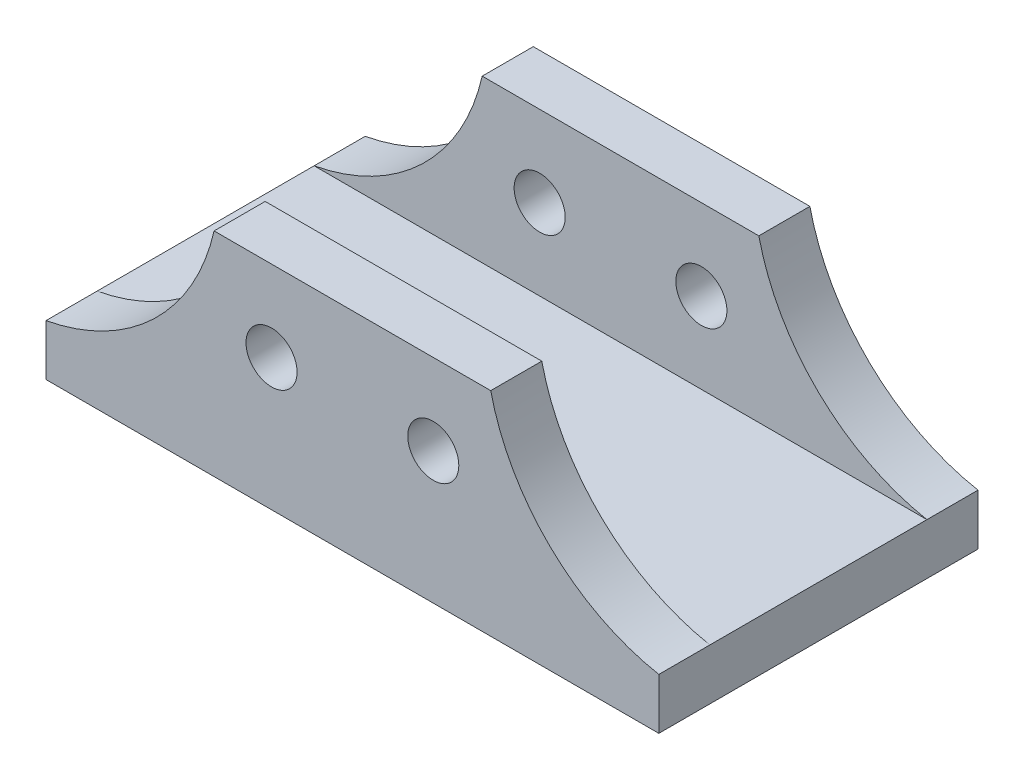
ISO-10303-21;
HEADER;
FILE_DESCRIPTION(('STEP AP214'),'2;1');
FILE_NAME('part.step','',(''),(''),'','','');
FILE_SCHEMA(('AUTOMOTIVE_DESIGN { 1 0 10303 214 1 1 1 1 }'));
ENDSEC;
DATA;
#1=APPLICATION_CONTEXT('core data for automotive mechanical design processes');
#2=APPLICATION_PROTOCOL_DEFINITION('international standard','automotive_design',2000,#1);
#3=PRODUCT_CONTEXT('',#1,'mechanical');
#4=PRODUCT('Part','Part','',(#3));
#5=PRODUCT_RELATED_PRODUCT_CATEGORY('part','',(#4));
#6=PRODUCT_DEFINITION_FORMATION('','',#4);
#7=PRODUCT_DEFINITION_CONTEXT('part definition',#1,'design');
#8=PRODUCT_DEFINITION('design','',#6,#7);
#9=PRODUCT_DEFINITION_SHAPE('','',#8);
#10=(LENGTH_UNIT() NAMED_UNIT(*) SI_UNIT(.MILLI.,.METRE.));
#11=(NAMED_UNIT(*) PLANE_ANGLE_UNIT() SI_UNIT($,.RADIAN.));
#12=(NAMED_UNIT(*) SI_UNIT($,.STERADIAN.) SOLID_ANGLE_UNIT());
#13=UNCERTAINTY_MEASURE_WITH_UNIT(LENGTH_MEASURE(1.E-05),#10,'distance_accuracy_value','');
#14=(GEOMETRIC_REPRESENTATION_CONTEXT(3) GLOBAL_UNCERTAINTY_ASSIGNED_CONTEXT((#13)) GLOBAL_UNIT_ASSIGNED_CONTEXT((#10,
#11,#12)) REPRESENTATION_CONTEXT('',''));
#15=CARTESIAN_POINT('',(0.,0.,0.));
#16=DIRECTION('',(0.,0.,1.));
#17=DIRECTION('',(1.,0.,0.));
#18=AXIS2_PLACEMENT_3D('',#15,#16,#17);
#19=CARTESIAN_POINT('',(81.2436376247931,61.1381233205086,12.));
#20=DIRECTION('',(0.,0.,-1.));
#21=DIRECTION('',(-1.,0.,0.));
#22=AXIS2_PLACEMENT_3D('',#19,#20,#21);
#23=PLANE('',#22);
#24=CARTESIAN_POINT('',(-19.,31.,12.));
#25=DIRECTION('',(0.,0.,1.));
#26=DIRECTION('',(-1.,0.,0.));
#27=AXIS2_PLACEMENT_3D('',#24,#25,#26);
#28=CIRCLE('',#27,6.);
#29=CARTESIAN_POINT('',(-25.,31.,12.));
#30=VERTEX_POINT('',#29);
#31=EDGE_CURVE('E177',#30,#30,#28,.T.);
#32=ORIENTED_EDGE('',*,*,#31,.F.);
#33=EDGE_LOOP('',(#32));
#34=FACE_BOUND('',#33,.T.);
#35=CARTESIAN_POINT('',(19.,31.,12.));
#36=DIRECTION('',(0.,0.,1.));
#37=DIRECTION('',(1.,0.,0.));
#38=AXIS2_PLACEMENT_3D('',#35,#36,#37);
#39=CIRCLE('',#38,6.);
#40=CARTESIAN_POINT('',(25.,31.,12.));
#41=VERTEX_POINT('',#40);
#42=EDGE_CURVE('E183',#41,#41,#39,.T.);
#43=ORIENTED_EDGE('',*,*,#42,.F.);
#44=EDGE_LOOP('',(#43));
#45=FACE_BOUND('',#44,.T.);
#46=DIRECTION('',(-1.,0.,0.));
#47=VECTOR('',#46,1.);
#48=CARTESIAN_POINT('',(-72.,12.,12.));
#49=LINE('',#48,#47);
#50=CARTESIAN_POINT('',(72.,12.,12.));
#51=VERTEX_POINT('',#50);
#52=CARTESIAN_POINT('',(-72.,12.,12.));
#53=VERTEX_POINT('',#52);
#54=EDGE_CURVE('E84',#51,#53,#49,.T.);
#55=ORIENTED_EDGE('',*,*,#54,.F.);
#56=CARTESIAN_POINT('',(81.2436376247931,61.1381233205086,12.));
#57=DIRECTION('',(0.,0.,-1.));
#58=DIRECTION('',(-1.,0.,0.));
#59=AXIS2_PLACEMENT_3D('',#56,#57,#58);
#60=CIRCLE('',#59,50.);
#61=CARTESIAN_POINT('',(32.5,50.,12.));
#62=VERTEX_POINT('',#61);
#63=EDGE_CURVE('E189',#51,#62,#60,.T.);
#64=ORIENTED_EDGE('',*,*,#63,.T.);
#65=DIRECTION('',(-1.,0.,0.));
#66=VECTOR('',#65,1.);
#67=CARTESIAN_POINT('',(-32.5,50.,12.));
#68=LINE('',#67,#66);
#69=CARTESIAN_POINT('',(-32.5,50.,12.));
#70=VERTEX_POINT('',#69);
#71=EDGE_CURVE('E50',#62,#70,#68,.T.);
#72=ORIENTED_EDGE('',*,*,#71,.T.);
#73=CARTESIAN_POINT('',(-81.2436376247931,61.1381233205086,12.));
#74=DIRECTION('',(0.,0.,-1.));
#75=DIRECTION('',(1.,0.,0.));
#76=AXIS2_PLACEMENT_3D('',#73,#74,#75);
#77=CIRCLE('',#76,50.);
#78=EDGE_CURVE('E192',#70,#53,#77,.T.);
#79=ORIENTED_EDGE('',*,*,#78,.T.);
#80=EDGE_LOOP('',(#55,#64,#72,#79));
#81=FACE_BOUND('',#80,.T.);
#82=ADVANCED_FACE('F33',(#34,#45,#81),#23,.F.);
#83=CARTESIAN_POINT('',(81.2436376247931,61.1381233205086,0.));
#84=DIRECTION('',(0.,0.,-1.));
#85=DIRECTION('',(-1.,0.,0.));
#86=AXIS2_PLACEMENT_3D('',#83,#84,#85);
#87=PLANE('',#86);
#88=CARTESIAN_POINT('',(19.,31.,0.));
#89=DIRECTION('',(0.,0.,1.));
#90=DIRECTION('',(1.,0.,0.));
#91=AXIS2_PLACEMENT_3D('',#88,#89,#90);
#92=CIRCLE('',#91,6.);
#93=CARTESIAN_POINT('',(25.,31.,0.));
#94=VERTEX_POINT('',#93);
#95=EDGE_CURVE('E180',#94,#94,#92,.T.);
#96=ORIENTED_EDGE('',*,*,#95,.T.);
#97=EDGE_LOOP('',(#96));
#98=FACE_BOUND('',#97,.T.);
#99=DIRECTION('',(0.,1.,0.));
#100=VECTOR('',#99,1.);
#101=CARTESIAN_POINT('',(72.,0.,0.));
#102=LINE('',#101,#100);
#103=CARTESIAN_POINT('',(72.,0.,0.));
#104=VERTEX_POINT('',#103);
#105=CARTESIAN_POINT('',(72.,12.,0.));
#106=VERTEX_POINT('',#105);
#107=EDGE_CURVE('E186',#104,#106,#102,.T.);
#108=ORIENTED_EDGE('',*,*,#107,.F.);
#109=DIRECTION('',(1.,0.,0.));
#110=VECTOR('',#109,1.);
#111=CARTESIAN_POINT('',(-72.,0.,0.));
#112=LINE('',#111,#110);
#113=CARTESIAN_POINT('',(-72.,0.,0.));
#114=VERTEX_POINT('',#113);
#115=EDGE_CURVE('E80',#114,#104,#112,.T.);
#116=ORIENTED_EDGE('',*,*,#115,.F.);
#117=DIRECTION('',(0.,-1.,0.));
#118=VECTOR('',#117,1.);
#119=CARTESIAN_POINT('',(-72.,0.,0.));
#120=LINE('',#119,#118);
#121=CARTESIAN_POINT('',(-72.,12.,0.));
#122=VERTEX_POINT('',#121);
#123=EDGE_CURVE('E74',#122,#114,#120,.T.);
#124=ORIENTED_EDGE('',*,*,#123,.F.);
#125=CARTESIAN_POINT('',(-81.2436376247931,61.1381233205086,0.));
#126=DIRECTION('',(0.,0.,-1.));
#127=DIRECTION('',(1.,0.,0.));
#128=AXIS2_PLACEMENT_3D('',#125,#126,#127);
#129=CIRCLE('',#128,50.);
#130=CARTESIAN_POINT('',(-32.5,50.,0.));
#131=VERTEX_POINT('',#130);
#132=EDGE_CURVE('E201',#131,#122,#129,.T.);
#133=ORIENTED_EDGE('',*,*,#132,.F.);
#134=DIRECTION('',(-1.,0.,0.));
#135=VECTOR('',#134,1.);
#136=CARTESIAN_POINT('',(-32.5,50.,0.));
#137=LINE('',#136,#135);
#138=CARTESIAN_POINT('',(32.5,50.,0.));
#139=VERTEX_POINT('',#138);
#140=EDGE_CURVE('E199',#139,#131,#137,.T.);
#141=ORIENTED_EDGE('',*,*,#140,.F.);
#142=CARTESIAN_POINT('',(81.2436376247931,61.1381233205086,0.));
#143=DIRECTION('',(0.,0.,-1.));
#144=DIRECTION('',(-1.,0.,0.));
#145=AXIS2_PLACEMENT_3D('',#142,#143,#144);
#146=CIRCLE('',#145,50.);
#147=EDGE_CURVE('E197',#106,#139,#146,.T.);
#148=ORIENTED_EDGE('',*,*,#147,.F.);
#149=EDGE_LOOP('',(#108,#116,#124,#133,#141,#148));
#150=FACE_BOUND('',#149,.T.);
#151=CARTESIAN_POINT('',(-19.,31.,0.));
#152=DIRECTION('',(0.,0.,1.));
#153=DIRECTION('',(-1.,0.,0.));
#154=AXIS2_PLACEMENT_3D('',#151,#152,#153);
#155=CIRCLE('',#154,6.);
#156=CARTESIAN_POINT('',(-25.,31.,0.));
#157=VERTEX_POINT('',#156);
#158=EDGE_CURVE('E171',#157,#157,#155,.T.);
#159=ORIENTED_EDGE('',*,*,#158,.T.);
#160=EDGE_LOOP('',(#159));
#161=FACE_BOUND('',#160,.T.);
#162=ADVANCED_FACE('F221',(#98,#150,#161),#87,.T.);
#163=CARTESIAN_POINT('',(72.,0.,12.));
#164=DIRECTION('',(-1.,0.,0.));
#165=DIRECTION('',(0.,0.,1.));
#166=AXIS2_PLACEMENT_3D('',#163,#164,#165);
#167=PLANE('',#166);
#168=ORIENTED_EDGE('',*,*,#107,.T.);
#169=DIRECTION('',(0.,0.,-1.));
#170=VECTOR('',#169,1.);
#171=CARTESIAN_POINT('',(72.,12.,12.));
#172=LINE('',#171,#170);
#173=EDGE_CURVE('E11',#51,#106,#172,.T.);
#174=ORIENTED_EDGE('',*,*,#173,.F.);
#175=DIRECTION('',(0.,0.,-1.));
#176=VECTOR('',#175,1.);
#177=CARTESIAN_POINT('',(72.,12.,207.499134945508));
#178=LINE('',#177,#176);
#179=CARTESIAN_POINT('',(72.,12.,63.));
#180=VERTEX_POINT('',#179);
#181=EDGE_CURVE('E172',#180,#51,#178,.T.);
#182=ORIENTED_EDGE('',*,*,#181,.F.);
#183=DIRECTION('',(0.,0.,1.));
#184=VECTOR('',#183,1.);
#185=CARTESIAN_POINT('',(72.,12.,63.));
#186=LINE('',#185,#184);
#187=CARTESIAN_POINT('',(72.,12.,75.));
#188=VERTEX_POINT('',#187);
#189=EDGE_CURVE('E130',#180,#188,#186,.T.);
#190=ORIENTED_EDGE('',*,*,#189,.T.);
#191=DIRECTION('',(0.,1.,0.));
#192=VECTOR('',#191,1.);
#193=CARTESIAN_POINT('',(72.,0.,75.));
#194=LINE('',#193,#192);
#195=CARTESIAN_POINT('',(72.,0.,75.));
#196=VERTEX_POINT('',#195);
#197=EDGE_CURVE('E149',#196,#188,#194,.T.);
#198=ORIENTED_EDGE('',*,*,#197,.F.);
#199=DIRECTION('',(0.,0.,-1.));
#200=VECTOR('',#199,1.);
#201=CARTESIAN_POINT('',(72.,0.,12.));
#202=LINE('',#201,#200);
#203=EDGE_CURVE('E194',#196,#104,#202,.T.);
#204=ORIENTED_EDGE('',*,*,#203,.T.);
#205=EDGE_LOOP('',(#168,#174,#182,#190,#198,#204));
#206=FACE_BOUND('',#205,.T.);
#207=ADVANCED_FACE('F35',(#206),#167,.F.);
#208=CARTESIAN_POINT('',(81.2436376247931,61.1381233205086,12.));
#209=DIRECTION('',(0.,0.,-1.));
#210=DIRECTION('',(-1.,0.,0.));
#211=AXIS2_PLACEMENT_3D('',#208,#209,#210);
#212=CYLINDRICAL_SURFACE('',#211,50.);
#213=ORIENTED_EDGE('',*,*,#147,.T.);
#214=DIRECTION('',(0.,0.,-1.));
#215=VECTOR('',#214,1.);
#216=CARTESIAN_POINT('',(32.5,50.,12.));
#217=LINE('',#216,#215);
#218=EDGE_CURVE('E42',#62,#139,#217,.T.);
#219=ORIENTED_EDGE('',*,*,#218,.F.);
#220=ORIENTED_EDGE('',*,*,#63,.F.);
#221=ORIENTED_EDGE('',*,*,#173,.T.);
#222=EDGE_LOOP('',(#213,#219,#220,#221));
#223=FACE_BOUND('',#222,.T.);
#224=ADVANCED_FACE('F235',(#223),#212,.F.);
#225=CARTESIAN_POINT('',(-32.5,50.,12.));
#226=DIRECTION('',(0.,-1.,0.));
#227=DIRECTION('',(0.,0.,-1.));
#228=AXIS2_PLACEMENT_3D('',#225,#226,#227);
#229=PLANE('',#228);
#230=ORIENTED_EDGE('',*,*,#140,.T.);
#231=DIRECTION('',(0.,0.,-1.));
#232=VECTOR('',#231,1.);
#233=CARTESIAN_POINT('',(-32.5,50.,12.));
#234=LINE('',#233,#232);
#235=EDGE_CURVE('E210',#70,#131,#234,.T.);
#236=ORIENTED_EDGE('',*,*,#235,.F.);
#237=ORIENTED_EDGE('',*,*,#71,.F.);
#238=ORIENTED_EDGE('',*,*,#218,.T.);
#239=EDGE_LOOP('',(#230,#236,#237,#238));
#240=FACE_BOUND('',#239,.T.);
#241=ADVANCED_FACE('F216',(#240),#229,.F.);
#242=CARTESIAN_POINT('',(-81.2436376247931,61.1381233205086,12.));
#243=DIRECTION('',(0.,0.,-1.));
#244=DIRECTION('',(-1.,0.,0.));
#245=AXIS2_PLACEMENT_3D('',#242,#243,#244);
#246=CYLINDRICAL_SURFACE('',#245,50.);
#247=ORIENTED_EDGE('',*,*,#132,.T.);
#248=DIRECTION('',(0.,0.,-1.));
#249=VECTOR('',#248,1.);
#250=CARTESIAN_POINT('',(-72.,12.,12.));
#251=LINE('',#250,#249);
#252=EDGE_CURVE('E208',#53,#122,#251,.T.);
#253=ORIENTED_EDGE('',*,*,#252,.F.);
#254=ORIENTED_EDGE('',*,*,#78,.F.);
#255=ORIENTED_EDGE('',*,*,#235,.T.);
#256=EDGE_LOOP('',(#247,#253,#254,#255));
#257=FACE_BOUND('',#256,.T.);
#258=ADVANCED_FACE('F224',(#257),#246,.F.);
#259=CARTESIAN_POINT('',(-72.,0.,12.));
#260=DIRECTION('',(1.,0.,0.));
#261=DIRECTION('',(0.,0.,-1.));
#262=AXIS2_PLACEMENT_3D('',#259,#260,#261);
#263=PLANE('',#262);
#264=ORIENTED_EDGE('',*,*,#123,.T.);
#265=DIRECTION('',(0.,0.,-1.));
#266=VECTOR('',#265,1.);
#267=CARTESIAN_POINT('',(-72.,0.,12.));
#268=LINE('',#267,#266);
#269=CARTESIAN_POINT('',(-72.,0.,75.));
#270=VERTEX_POINT('',#269);
#271=EDGE_CURVE('E206',#270,#114,#268,.T.);
#272=ORIENTED_EDGE('',*,*,#271,.F.);
#273=DIRECTION('',(0.,-1.,0.));
#274=VECTOR('',#273,1.);
#275=CARTESIAN_POINT('',(-72.,0.,75.));
#276=LINE('',#275,#274);
#277=CARTESIAN_POINT('',(-72.,12.,75.));
#278=VERTEX_POINT('',#277);
#279=EDGE_CURVE('E159',#278,#270,#276,.T.);
#280=ORIENTED_EDGE('',*,*,#279,.F.);
#281=DIRECTION('',(0.,0.,1.));
#282=VECTOR('',#281,1.);
#283=CARTESIAN_POINT('',(-72.,12.,63.));
#284=LINE('',#283,#282);
#285=CARTESIAN_POINT('',(-72.,12.,63.));
#286=VERTEX_POINT('',#285);
#287=EDGE_CURVE('E145',#286,#278,#284,.T.);
#288=ORIENTED_EDGE('',*,*,#287,.F.);
#289=DIRECTION('',(0.,0.,-1.));
#290=VECTOR('',#289,1.);
#291=CARTESIAN_POINT('',(-72.,12.,207.499134945508));
#292=LINE('',#291,#290);
#293=EDGE_CURVE('E168',#286,#53,#292,.T.);
#294=ORIENTED_EDGE('',*,*,#293,.T.);
#295=ORIENTED_EDGE('',*,*,#252,.T.);
#296=EDGE_LOOP('',(#264,#272,#280,#288,#294,#295));
#297=FACE_BOUND('',#296,.T.);
#298=ADVANCED_FACE('F226',(#297),#263,.F.);
#299=CARTESIAN_POINT('',(-72.,0.,12.));
#300=DIRECTION('',(0.,1.,0.));
#301=DIRECTION('',(0.,0.,1.));
#302=AXIS2_PLACEMENT_3D('',#299,#300,#301);
#303=PLANE('',#302);
#304=ORIENTED_EDGE('',*,*,#115,.T.);
#305=ORIENTED_EDGE('',*,*,#203,.F.);
#306=DIRECTION('',(1.,0.,0.));
#307=VECTOR('',#306,1.);
#308=CARTESIAN_POINT('',(-72.,0.,75.));
#309=LINE('',#308,#307);
#310=EDGE_CURVE('E139',#270,#196,#309,.T.);
#311=ORIENTED_EDGE('',*,*,#310,.F.);
#312=ORIENTED_EDGE('',*,*,#271,.T.);
#313=EDGE_LOOP('',(#304,#305,#311,#312));
#314=FACE_BOUND('',#313,.T.);
#315=ADVANCED_FACE('F250',(#314),#303,.F.);
#316=CARTESIAN_POINT('',(19.,31.,12.));
#317=DIRECTION('',(0.,0.,-1.));
#318=DIRECTION('',(-1.,0.,0.));
#319=AXIS2_PLACEMENT_3D('',#316,#317,#318);
#320=CYLINDRICAL_SURFACE('',#319,6.);
#321=ORIENTED_EDGE('',*,*,#42,.T.);
#322=EDGE_LOOP('',(#321));
#323=FACE_BOUND('',#322,.T.);
#324=ORIENTED_EDGE('',*,*,#95,.F.);
#325=EDGE_LOOP('',(#324));
#326=FACE_BOUND('',#325,.T.);
#327=ADVANCED_FACE('F247',(#323,#326),#320,.F.);
#328=CARTESIAN_POINT('',(-19.,31.,12.));
#329=DIRECTION('',(0.,0.,-1.));
#330=DIRECTION('',(-1.,0.,0.));
#331=AXIS2_PLACEMENT_3D('',#328,#329,#330);
#332=CYLINDRICAL_SURFACE('',#331,6.);
#333=ORIENTED_EDGE('',*,*,#31,.T.);
#334=EDGE_LOOP('',(#333));
#335=FACE_BOUND('',#334,.T.);
#336=ORIENTED_EDGE('',*,*,#158,.F.);
#337=EDGE_LOOP('',(#336));
#338=FACE_BOUND('',#337,.T.);
#339=ADVANCED_FACE('F292',(#335,#338),#332,.F.);
#340=CARTESIAN_POINT('',(-72.,12.,207.499134945508));
#341=DIRECTION('',(0.,-1.,0.));
#342=DIRECTION('',(0.,0.,-1.));
#343=AXIS2_PLACEMENT_3D('',#340,#341,#342);
#344=PLANE('',#343);
#345=DIRECTION('',(-1.,0.,0.));
#346=VECTOR('',#345,1.);
#347=CARTESIAN_POINT('',(-72.,12.,63.));
#348=LINE('',#347,#346);
#349=EDGE_CURVE('E169',#180,#286,#348,.T.);
#350=ORIENTED_EDGE('',*,*,#349,.F.);
#351=ORIENTED_EDGE('',*,*,#181,.T.);
#352=ORIENTED_EDGE('',*,*,#54,.T.);
#353=ORIENTED_EDGE('',*,*,#293,.F.);
#354=EDGE_LOOP('',(#350,#351,#352,#353));
#355=FACE_BOUND('',#354,.T.);
#356=ADVANCED_FACE('F231',(#355),#344,.F.);
#357=CARTESIAN_POINT('',(81.2436376247931,61.1381233205086,63.));
#358=DIRECTION('',(0.,0.,1.));
#359=DIRECTION('',(-1.,0.,0.));
#360=AXIS2_PLACEMENT_3D('',#357,#358,#359);
#361=PLANE('',#360);
#362=CARTESIAN_POINT('',(19.,31.,63.));
#363=DIRECTION('',(0.,0.,1.));
#364=DIRECTION('',(1.,0.,0.));
#365=AXIS2_PLACEMENT_3D('',#362,#363,#364);
#366=CIRCLE('',#365,6.);
#367=CARTESIAN_POINT('',(25.,31.,63.));
#368=VERTEX_POINT('',#367);
#369=EDGE_CURVE('E153',#368,#368,#366,.T.);
#370=ORIENTED_EDGE('',*,*,#369,.T.);
#371=EDGE_LOOP('',(#370));
#372=FACE_BOUND('',#371,.T.);
#373=CARTESIAN_POINT('',(-19.,31.,63.));
#374=DIRECTION('',(0.,0.,1.));
#375=DIRECTION('',(-1.,0.,0.));
#376=AXIS2_PLACEMENT_3D('',#373,#374,#375);
#377=CIRCLE('',#376,6.);
#378=CARTESIAN_POINT('',(-25.,31.,63.));
#379=VERTEX_POINT('',#378);
#380=EDGE_CURVE('E417',#379,#379,#377,.T.);
#381=ORIENTED_EDGE('',*,*,#380,.T.);
#382=EDGE_LOOP('',(#381));
#383=FACE_BOUND('',#382,.T.);
#384=CARTESIAN_POINT('',(81.2436376247931,61.1381233205086,63.));
#385=DIRECTION('',(0.,0.,-1.));
#386=DIRECTION('',(-1.,0.,0.));
#387=AXIS2_PLACEMENT_3D('',#384,#385,#386);
#388=CIRCLE('',#387,50.);
#389=CARTESIAN_POINT('',(32.5,50.,63.));
#390=VERTEX_POINT('',#389);
#391=EDGE_CURVE('E135',#180,#390,#388,.T.);
#392=ORIENTED_EDGE('',*,*,#391,.F.);
#393=ORIENTED_EDGE('',*,*,#349,.T.);
#394=CARTESIAN_POINT('',(-81.2436376247931,61.1381233205086,63.));
#395=DIRECTION('',(0.,0.,-1.));
#396=DIRECTION('',(1.,0.,0.));
#397=AXIS2_PLACEMENT_3D('',#394,#395,#396);
#398=CIRCLE('',#397,50.);
#399=CARTESIAN_POINT('',(-32.5,50.,63.));
#400=VERTEX_POINT('',#399);
#401=EDGE_CURVE('E143',#400,#286,#398,.T.);
#402=ORIENTED_EDGE('',*,*,#401,.F.);
#403=DIRECTION('',(-1.,0.,0.));
#404=VECTOR('',#403,1.);
#405=CARTESIAN_POINT('',(-32.5,50.,63.));
#406=LINE('',#405,#404);
#407=EDGE_CURVE('E123',#390,#400,#406,.T.);
#408=ORIENTED_EDGE('',*,*,#407,.F.);
#409=EDGE_LOOP('',(#392,#393,#402,#408));
#410=FACE_BOUND('',#409,.T.);
#411=ADVANCED_FACE('F141',(#372,#383,#410),#361,.F.);
#412=CARTESIAN_POINT('',(81.2436376247931,61.1381233205086,75.));
#413=DIRECTION('',(0.,0.,1.));
#414=DIRECTION('',(-1.,0.,0.));
#415=AXIS2_PLACEMENT_3D('',#412,#413,#414);
#416=PLANE('',#415);
#417=CARTESIAN_POINT('',(19.,31.,75.));
#418=DIRECTION('',(0.,0.,1.));
#419=DIRECTION('',(1.,0.,0.));
#420=AXIS2_PLACEMENT_3D('',#417,#418,#419);
#421=CIRCLE('',#420,6.);
#422=CARTESIAN_POINT('',(25.,31.,75.));
#423=VERTEX_POINT('',#422);
#424=EDGE_CURVE('E423',#423,#423,#421,.T.);
#425=ORIENTED_EDGE('',*,*,#424,.F.);
#426=EDGE_LOOP('',(#425));
#427=FACE_BOUND('',#426,.T.);
#428=ORIENTED_EDGE('',*,*,#197,.T.);
#429=CARTESIAN_POINT('',(81.2436376247931,61.1381233205086,75.));
#430=DIRECTION('',(0.,0.,-1.));
#431=DIRECTION('',(-1.,0.,0.));
#432=AXIS2_PLACEMENT_3D('',#429,#430,#431);
#433=CIRCLE('',#432,50.);
#434=CARTESIAN_POINT('',(32.5,50.,75.));
#435=VERTEX_POINT('',#434);
#436=EDGE_CURVE('E152',#188,#435,#433,.T.);
#437=ORIENTED_EDGE('',*,*,#436,.T.);
#438=DIRECTION('',(-1.,0.,0.));
#439=VECTOR('',#438,1.);
#440=CARTESIAN_POINT('',(-32.5,50.,75.));
#441=LINE('',#440,#439);
#442=CARTESIAN_POINT('',(-32.5,50.,75.));
#443=VERTEX_POINT('',#442);
#444=EDGE_CURVE('E126',#435,#443,#441,.T.);
#445=ORIENTED_EDGE('',*,*,#444,.T.);
#446=CARTESIAN_POINT('',(-81.2436376247931,61.1381233205086,75.));
#447=DIRECTION('',(0.,0.,-1.));
#448=DIRECTION('',(1.,0.,0.));
#449=AXIS2_PLACEMENT_3D('',#446,#447,#448);
#450=CIRCLE('',#449,50.);
#451=EDGE_CURVE('E156',#443,#278,#450,.T.);
#452=ORIENTED_EDGE('',*,*,#451,.T.);
#453=ORIENTED_EDGE('',*,*,#279,.T.);
#454=ORIENTED_EDGE('',*,*,#310,.T.);
#455=EDGE_LOOP('',(#428,#437,#445,#452,#453,#454));
#456=FACE_BOUND('',#455,.T.);
#457=CARTESIAN_POINT('',(-19.,31.,75.));
#458=DIRECTION('',(0.,0.,1.));
#459=DIRECTION('',(-1.,0.,0.));
#460=AXIS2_PLACEMENT_3D('',#457,#458,#459);
#461=CIRCLE('',#460,6.);
#462=CARTESIAN_POINT('',(-25.,31.,75.));
#463=VERTEX_POINT('',#462);
#464=EDGE_CURVE('E420',#463,#463,#461,.T.);
#465=ORIENTED_EDGE('',*,*,#464,.F.);
#466=EDGE_LOOP('',(#465));
#467=FACE_BOUND('',#466,.T.);
#468=ADVANCED_FACE('F316',(#427,#456,#467),#416,.T.);
#469=CARTESIAN_POINT('',(81.2436376247931,61.1381233205086,63.));
#470=DIRECTION('',(0.,0.,1.));
#471=DIRECTION('',(-1.,0.,0.));
#472=AXIS2_PLACEMENT_3D('',#469,#470,#471);
#473=CYLINDRICAL_SURFACE('',#472,50.);
#474=ORIENTED_EDGE('',*,*,#436,.F.);
#475=ORIENTED_EDGE('',*,*,#189,.F.);
#476=ORIENTED_EDGE('',*,*,#391,.T.);
#477=DIRECTION('',(0.,0.,1.));
#478=VECTOR('',#477,1.);
#479=CARTESIAN_POINT('',(32.5,50.,63.));
#480=LINE('',#479,#478);
#481=EDGE_CURVE('E119',#390,#435,#480,.T.);
#482=ORIENTED_EDGE('',*,*,#481,.T.);
#483=EDGE_LOOP('',(#474,#475,#476,#482));
#484=FACE_BOUND('',#483,.T.);
#485=ADVANCED_FACE('F136',(#484),#473,.F.);
#486=CARTESIAN_POINT('',(-32.5,50.,63.));
#487=DIRECTION('',(0.,-1.,0.));
#488=DIRECTION('',(0.,0.,1.));
#489=AXIS2_PLACEMENT_3D('',#486,#487,#488);
#490=PLANE('',#489);
#491=ORIENTED_EDGE('',*,*,#444,.F.);
#492=ORIENTED_EDGE('',*,*,#481,.F.);
#493=ORIENTED_EDGE('',*,*,#407,.T.);
#494=DIRECTION('',(0.,0.,1.));
#495=VECTOR('',#494,1.);
#496=CARTESIAN_POINT('',(-32.5,50.,63.));
#497=LINE('',#496,#495);
#498=EDGE_CURVE('E131',#400,#443,#497,.T.);
#499=ORIENTED_EDGE('',*,*,#498,.T.);
#500=EDGE_LOOP('',(#491,#492,#493,#499));
#501=FACE_BOUND('',#500,.T.);
#502=ADVANCED_FACE('F121',(#501),#490,.F.);
#503=CARTESIAN_POINT('',(-81.2436376247931,61.1381233205086,63.));
#504=DIRECTION('',(0.,0.,1.));
#505=DIRECTION('',(-1.,0.,0.));
#506=AXIS2_PLACEMENT_3D('',#503,#504,#505);
#507=CYLINDRICAL_SURFACE('',#506,50.);
#508=ORIENTED_EDGE('',*,*,#451,.F.);
#509=ORIENTED_EDGE('',*,*,#498,.F.);
#510=ORIENTED_EDGE('',*,*,#401,.T.);
#511=ORIENTED_EDGE('',*,*,#287,.T.);
#512=EDGE_LOOP('',(#508,#509,#510,#511));
#513=FACE_BOUND('',#512,.T.);
#514=ADVANCED_FACE('F341',(#513),#507,.F.);
#515=CARTESIAN_POINT('',(19.,31.,63.));
#516=DIRECTION('',(0.,0.,1.));
#517=DIRECTION('',(-1.,0.,0.));
#518=AXIS2_PLACEMENT_3D('',#515,#516,#517);
#519=CYLINDRICAL_SURFACE('',#518,6.);
#520=ORIENTED_EDGE('',*,*,#369,.F.);
#521=EDGE_LOOP('',(#520));
#522=FACE_BOUND('',#521,.T.);
#523=ORIENTED_EDGE('',*,*,#424,.T.);
#524=EDGE_LOOP('',(#523));
#525=FACE_BOUND('',#524,.T.);
#526=ADVANCED_FACE('F349',(#522,#525),#519,.F.);
#527=CARTESIAN_POINT('',(-19.,31.,63.));
#528=DIRECTION('',(0.,0.,1.));
#529=DIRECTION('',(-1.,0.,0.));
#530=AXIS2_PLACEMENT_3D('',#527,#528,#529);
#531=CYLINDRICAL_SURFACE('',#530,6.);
#532=ORIENTED_EDGE('',*,*,#380,.F.);
#533=EDGE_LOOP('',(#532));
#534=FACE_BOUND('',#533,.T.);
#535=ORIENTED_EDGE('',*,*,#464,.T.);
#536=EDGE_LOOP('',(#535));
#537=FACE_BOUND('',#536,.T.);
#538=ADVANCED_FACE('F358',(#534,#537),#531,.F.);
#539=CLOSED_SHELL('',(#82,#162,#207,#224,#241,#258,#298,#315,#327,#339,#356,#411,#468,#485,#502,
#514,#526,#538));
#540=MANIFOLD_SOLID_BREP('B2',#539);
#541=ADVANCED_BREP_SHAPE_REPRESENTATION('',(#18,#540),#14);
#542=SHAPE_DEFINITION_REPRESENTATION(#9,#541);
ENDSEC;
END-ISO-10303-21;
